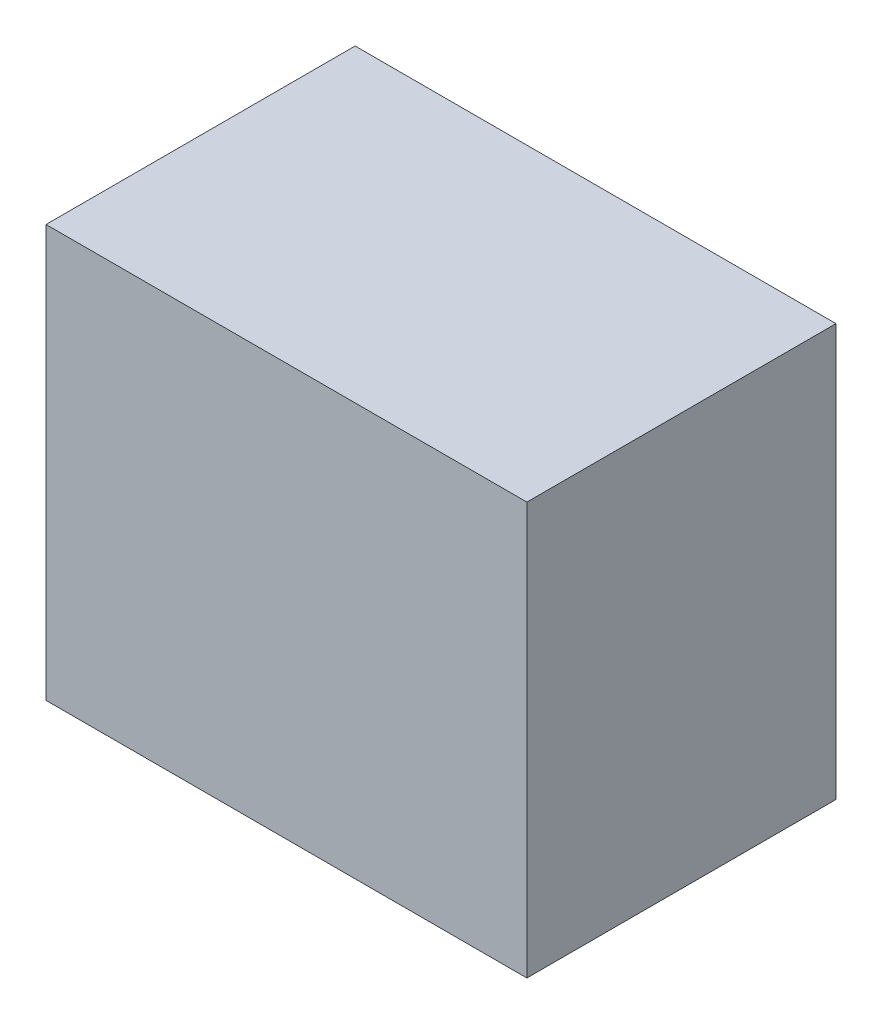
ISO-10303-21;
HEADER;
FILE_DESCRIPTION(('STEP AP214'),'2;1');
FILE_NAME('part.step','',(''),(''),'','','');
FILE_SCHEMA(('AUTOMOTIVE_DESIGN { 1 0 10303 214 1 1 1 1 }'));
ENDSEC;
DATA;
#1=APPLICATION_CONTEXT('core data for automotive mechanical design processes');
#2=APPLICATION_PROTOCOL_DEFINITION('international standard','automotive_design',2000,#1);
#3=PRODUCT_CONTEXT('',#1,'mechanical');
#4=PRODUCT('Part','Part','',(#3));
#5=PRODUCT_RELATED_PRODUCT_CATEGORY('part','',(#4));
#6=PRODUCT_DEFINITION_FORMATION('','',#4);
#7=PRODUCT_DEFINITION_CONTEXT('part definition',#1,'design');
#8=PRODUCT_DEFINITION('design','',#6,#7);
#9=PRODUCT_DEFINITION_SHAPE('','',#8);
#10=(LENGTH_UNIT() NAMED_UNIT(*) SI_UNIT(.MILLI.,.METRE.));
#11=(NAMED_UNIT(*) PLANE_ANGLE_UNIT() SI_UNIT($,.RADIAN.));
#12=(NAMED_UNIT(*) SI_UNIT($,.STERADIAN.) SOLID_ANGLE_UNIT());
#13=UNCERTAINTY_MEASURE_WITH_UNIT(LENGTH_MEASURE(1.E-05),#10,'distance_accuracy_value','');
#14=(GEOMETRIC_REPRESENTATION_CONTEXT(3) GLOBAL_UNCERTAINTY_ASSIGNED_CONTEXT((#13)) GLOBAL_UNIT_ASSIGNED_CONTEXT((#10,
#11,#12)) REPRESENTATION_CONTEXT('',''));
#15=CARTESIAN_POINT('',(0.,0.,0.));
#16=DIRECTION('',(0.,0.,1.));
#17=DIRECTION('',(1.,0.,0.));
#18=AXIS2_PLACEMENT_3D('',#15,#16,#17);
#19=CARTESIAN_POINT('',(22.225,38.1,14.2875));
#20=DIRECTION('',(-1.,0.,0.));
#21=DIRECTION('',(0.,0.,1.));
#22=AXIS2_PLACEMENT_3D('',#19,#20,#21);
#23=PLANE('',#22);
#24=DIRECTION('',(0.,0.,-1.));
#25=VECTOR('',#24,1.);
#26=CARTESIAN_POINT('',(22.225,0.,14.2875));
#27=LINE('',#26,#25);
#28=CARTESIAN_POINT('',(22.225,0.,14.2875));
#29=VERTEX_POINT('',#28);
#30=CARTESIAN_POINT('',(22.225,0.,-14.2875));
#31=VERTEX_POINT('',#30);
#32=EDGE_CURVE('E107',#29,#31,#27,.T.);
#33=ORIENTED_EDGE('',*,*,#32,.T.);
#34=DIRECTION('',(0.,-1.,0.));
#35=VECTOR('',#34,1.);
#36=CARTESIAN_POINT('',(22.225,38.1,-14.2875));
#37=LINE('',#36,#35);
#38=CARTESIAN_POINT('',(22.225,38.1,-14.2875));
#39=VERTEX_POINT('',#38);
#40=EDGE_CURVE('E11',#39,#31,#37,.T.);
#41=ORIENTED_EDGE('',*,*,#40,.F.);
#42=DIRECTION('',(0.,0.,-1.));
#43=VECTOR('',#42,1.);
#44=CARTESIAN_POINT('',(22.225,38.1,14.2875));
#45=LINE('',#44,#43);
#46=CARTESIAN_POINT('',(22.225,38.1,14.2875));
#47=VERTEX_POINT('',#46);
#48=EDGE_CURVE('E91',#47,#39,#45,.T.);
#49=ORIENTED_EDGE('',*,*,#48,.F.);
#50=DIRECTION('',(0.,-1.,0.));
#51=VECTOR('',#50,1.);
#52=CARTESIAN_POINT('',(22.225,38.1,14.2875));
#53=LINE('',#52,#51);
#54=EDGE_CURVE('E103',#47,#29,#53,.T.);
#55=ORIENTED_EDGE('',*,*,#54,.T.);
#56=EDGE_LOOP('',(#33,#41,#49,#55));
#57=FACE_BOUND('',#56,.T.);
#58=ADVANCED_FACE('F39',(#57),#23,.F.);
#59=CARTESIAN_POINT('',(-22.225,38.1,-14.2875));
#60=DIRECTION('',(0.,0.,1.));
#61=DIRECTION('',(1.,0.,0.));
#62=AXIS2_PLACEMENT_3D('',#59,#60,#61);
#63=PLANE('',#62);
#64=DIRECTION('',(-1.,0.,0.));
#65=VECTOR('',#64,1.);
#66=CARTESIAN_POINT('',(-22.225,0.,-14.2875));
#67=LINE('',#66,#65);
#68=CARTESIAN_POINT('',(-22.225,0.,-14.2875));
#69=VERTEX_POINT('',#68);
#70=EDGE_CURVE('E96',#31,#69,#67,.T.);
#71=ORIENTED_EDGE('',*,*,#70,.T.);
#72=DIRECTION('',(0.,-1.,0.));
#73=VECTOR('',#72,1.);
#74=CARTESIAN_POINT('',(-22.225,38.1,-14.2875));
#75=LINE('',#74,#73);
#76=CARTESIAN_POINT('',(-22.225,38.1,-14.2875));
#77=VERTEX_POINT('',#76);
#78=EDGE_CURVE('E48',#77,#69,#75,.T.);
#79=ORIENTED_EDGE('',*,*,#78,.F.);
#80=DIRECTION('',(-1.,0.,0.));
#81=VECTOR('',#80,1.);
#82=CARTESIAN_POINT('',(-22.225,38.1,-14.2875));
#83=LINE('',#82,#81);
#84=EDGE_CURVE('E86',#39,#77,#83,.T.);
#85=ORIENTED_EDGE('',*,*,#84,.F.);
#86=ORIENTED_EDGE('',*,*,#40,.T.);
#87=EDGE_LOOP('',(#71,#79,#85,#86));
#88=FACE_BOUND('',#87,.T.);
#89=ADVANCED_FACE('F95',(#88),#63,.F.);
#90=CARTESIAN_POINT('',(-22.225,38.1,14.2875));
#91=DIRECTION('',(1.,0.,0.));
#92=DIRECTION('',(0.,0.,-1.));
#93=AXIS2_PLACEMENT_3D('',#90,#91,#92);
#94=PLANE('',#93);
#95=DIRECTION('',(0.,0.,1.));
#96=VECTOR('',#95,1.);
#97=CARTESIAN_POINT('',(-22.225,0.,14.2875));
#98=LINE('',#97,#96);
#99=CARTESIAN_POINT('',(-22.225,0.,14.2875));
#100=VERTEX_POINT('',#99);
#101=EDGE_CURVE('E73',#69,#100,#98,.T.);
#102=ORIENTED_EDGE('',*,*,#101,.T.);
#103=DIRECTION('',(0.,-1.,0.));
#104=VECTOR('',#103,1.);
#105=CARTESIAN_POINT('',(-22.225,38.1,14.2875));
#106=LINE('',#105,#104);
#107=CARTESIAN_POINT('',(-22.225,38.1,14.2875));
#108=VERTEX_POINT('',#107);
#109=EDGE_CURVE('E98',#108,#100,#106,.T.);
#110=ORIENTED_EDGE('',*,*,#109,.F.);
#111=DIRECTION('',(0.,0.,1.));
#112=VECTOR('',#111,1.);
#113=CARTESIAN_POINT('',(-22.225,38.1,14.2875));
#114=LINE('',#113,#112);
#115=EDGE_CURVE('E89',#77,#108,#114,.T.);
#116=ORIENTED_EDGE('',*,*,#115,.F.);
#117=ORIENTED_EDGE('',*,*,#78,.T.);
#118=EDGE_LOOP('',(#102,#110,#116,#117));
#119=FACE_BOUND('',#118,.T.);
#120=ADVANCED_FACE('F99',(#119),#94,.F.);
#121=CARTESIAN_POINT('',(-22.225,38.1,14.2875));
#122=DIRECTION('',(0.,0.,-1.));
#123=DIRECTION('',(-1.,0.,0.));
#124=AXIS2_PLACEMENT_3D('',#121,#122,#123);
#125=PLANE('',#124);
#126=DIRECTION('',(1.,0.,0.));
#127=VECTOR('',#126,1.);
#128=CARTESIAN_POINT('',(-22.225,0.,14.2875));
#129=LINE('',#128,#127);
#130=EDGE_CURVE('E79',#100,#29,#129,.T.);
#131=ORIENTED_EDGE('',*,*,#130,.T.);
#132=ORIENTED_EDGE('',*,*,#54,.F.);
#133=DIRECTION('',(1.,0.,0.));
#134=VECTOR('',#133,1.);
#135=CARTESIAN_POINT('',(-22.225,38.1,14.2875));
#136=LINE('',#135,#134);
#137=EDGE_CURVE('E56',#108,#47,#136,.T.);
#138=ORIENTED_EDGE('',*,*,#137,.F.);
#139=ORIENTED_EDGE('',*,*,#109,.T.);
#140=EDGE_LOOP('',(#131,#132,#138,#139));
#141=FACE_BOUND('',#140,.T.);
#142=ADVANCED_FACE('F120',(#141),#125,.F.);
#143=CARTESIAN_POINT('',(0.,38.1,0.));
#144=DIRECTION('',(0.,-1.,0.));
#145=DIRECTION('',(0.,0.,-1.));
#146=AXIS2_PLACEMENT_3D('',#143,#144,#145);
#147=PLANE('',#146);
#148=ORIENTED_EDGE('',*,*,#48,.T.);
#149=ORIENTED_EDGE('',*,*,#84,.T.);
#150=ORIENTED_EDGE('',*,*,#115,.T.);
#151=ORIENTED_EDGE('',*,*,#137,.T.);
#152=EDGE_LOOP('',(#148,#149,#150,#151));
#153=FACE_BOUND('',#152,.T.);
#154=ADVANCED_FACE('F87',(#153),#147,.F.);
#155=CARTESIAN_POINT('',(0.,0.,0.));
#156=DIRECTION('',(0.,-1.,0.));
#157=DIRECTION('',(0.,0.,-1.));
#158=AXIS2_PLACEMENT_3D('',#155,#156,#157);
#159=PLANE('',#158);
#160=ORIENTED_EDGE('',*,*,#32,.F.);
#161=ORIENTED_EDGE('',*,*,#130,.F.);
#162=ORIENTED_EDGE('',*,*,#101,.F.);
#163=ORIENTED_EDGE('',*,*,#70,.F.);
#164=EDGE_LOOP('',(#160,#161,#162,#163));
#165=FACE_BOUND('',#164,.T.);
#166=ADVANCED_FACE('F123',(#165),#159,.T.);
#167=CLOSED_SHELL('',(#58,#89,#120,#142,#154,#166));
#168=MANIFOLD_SOLID_BREP('B2',#167);
#169=ADVANCED_BREP_SHAPE_REPRESENTATION('',(#18,#168),#14);
#170=SHAPE_DEFINITION_REPRESENTATION(#9,#169);
ENDSEC;
END-ISO-10303-21;
